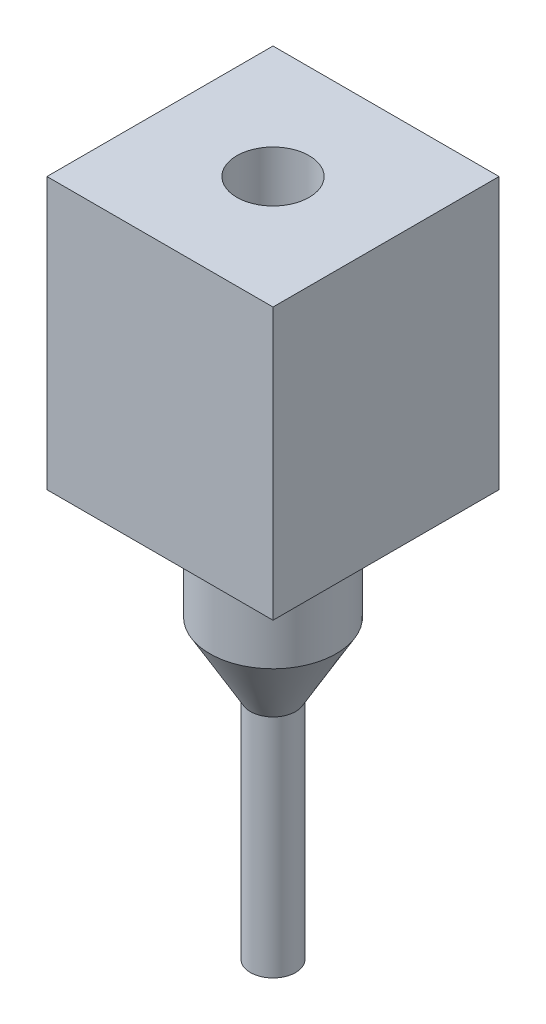
ISO-10303-21;
HEADER;
FILE_DESCRIPTION(('STEP AP214'),'2;1');
FILE_NAME('part.step','',(''),(''),'','','');
FILE_SCHEMA(('AUTOMOTIVE_DESIGN { 1 0 10303 214 1 1 1 1 }'));
ENDSEC;
DATA;
#1=APPLICATION_CONTEXT('core data for automotive mechanical design processes');
#2=APPLICATION_PROTOCOL_DEFINITION('international standard','automotive_design',2000,#1);
#3=PRODUCT_CONTEXT('',#1,'mechanical');
#4=PRODUCT('Part','Part','',(#3));
#5=PRODUCT_RELATED_PRODUCT_CATEGORY('part','',(#4));
#6=PRODUCT_DEFINITION_FORMATION('','',#4);
#7=PRODUCT_DEFINITION_CONTEXT('part definition',#1,'design');
#8=PRODUCT_DEFINITION('design','',#6,#7);
#9=PRODUCT_DEFINITION_SHAPE('','',#8);
#10=(LENGTH_UNIT() NAMED_UNIT(*) SI_UNIT(.MILLI.,.METRE.));
#11=(NAMED_UNIT(*) PLANE_ANGLE_UNIT() SI_UNIT($,.RADIAN.));
#12=(NAMED_UNIT(*) SI_UNIT($,.STERADIAN.) SOLID_ANGLE_UNIT());
#13=UNCERTAINTY_MEASURE_WITH_UNIT(LENGTH_MEASURE(1.E-05),#10,'distance_accuracy_value','');
#14=(GEOMETRIC_REPRESENTATION_CONTEXT(3) GLOBAL_UNCERTAINTY_ASSIGNED_CONTEXT((#13)) GLOBAL_UNIT_ASSIGNED_CONTEXT((#10,
#11,#12)) REPRESENTATION_CONTEXT('',''));
#15=CARTESIAN_POINT('',(0.,0.,0.));
#16=DIRECTION('',(0.,0.,1.));
#17=DIRECTION('',(1.,0.,0.));
#18=AXIS2_PLACEMENT_3D('',#15,#16,#17);
#19=CARTESIAN_POINT('',(-1.25,3.,-1.25));
#20=DIRECTION('',(1.,0.,0.));
#21=DIRECTION('',(0.,0.,-1.));
#22=AXIS2_PLACEMENT_3D('',#19,#20,#21);
#23=PLANE('',#22);
#24=DIRECTION('',(0.,0.,1.));
#25=VECTOR('',#24,1.);
#26=CARTESIAN_POINT('',(-1.25,0.,-1.25));
#27=LINE('',#26,#25);
#28=CARTESIAN_POINT('',(-1.25,0.,-1.25));
#29=VERTEX_POINT('',#28);
#30=CARTESIAN_POINT('',(-1.25,0.,1.25));
#31=VERTEX_POINT('',#30);
#32=EDGE_CURVE('E105',#29,#31,#27,.T.);
#33=ORIENTED_EDGE('',*,*,#32,.T.);
#34=DIRECTION('',(0.,-1.,0.));
#35=VECTOR('',#34,1.);
#36=CARTESIAN_POINT('',(-1.25,3.,1.25));
#37=LINE('',#36,#35);
#38=CARTESIAN_POINT('',(-1.25,3.,1.25));
#39=VERTEX_POINT('',#38);
#40=EDGE_CURVE('E96',#39,#31,#37,.T.);
#41=ORIENTED_EDGE('',*,*,#40,.F.);
#42=DIRECTION('',(0.,0.,1.));
#43=VECTOR('',#42,1.);
#44=CARTESIAN_POINT('',(-1.25,3.,-1.25));
#45=LINE('',#44,#43);
#46=CARTESIAN_POINT('',(-1.25,3.,-1.25));
#47=VERTEX_POINT('',#46);
#48=EDGE_CURVE('E90',#47,#39,#45,.T.);
#49=ORIENTED_EDGE('',*,*,#48,.F.);
#50=DIRECTION('',(0.,-1.,0.));
#51=VECTOR('',#50,1.);
#52=CARTESIAN_POINT('',(-1.25,3.,-1.25));
#53=LINE('',#52,#51);
#54=EDGE_CURVE('E101',#47,#29,#53,.T.);
#55=ORIENTED_EDGE('',*,*,#54,.T.);
#56=EDGE_LOOP('',(#33,#41,#49,#55));
#57=FACE_BOUND('',#56,.T.);
#58=ADVANCED_FACE('F37',(#57),#23,.F.);
#59=CARTESIAN_POINT('',(1.25,3.,1.25));
#60=DIRECTION('',(0.,0.,-1.));
#61=DIRECTION('',(-1.,0.,0.));
#62=AXIS2_PLACEMENT_3D('',#59,#60,#61);
#63=PLANE('',#62);
#64=DIRECTION('',(1.,0.,0.));
#65=VECTOR('',#64,1.);
#66=CARTESIAN_POINT('',(1.25,0.,1.25));
#67=LINE('',#66,#65);
#68=CARTESIAN_POINT('',(1.25,0.,1.25));
#69=VERTEX_POINT('',#68);
#70=EDGE_CURVE('E95',#31,#69,#67,.T.);
#71=ORIENTED_EDGE('',*,*,#70,.T.);
#72=DIRECTION('',(0.,-1.,0.));
#73=VECTOR('',#72,1.);
#74=CARTESIAN_POINT('',(1.25,3.,1.25));
#75=LINE('',#74,#73);
#76=CARTESIAN_POINT('',(1.25,3.,1.25));
#77=VERTEX_POINT('',#76);
#78=EDGE_CURVE('E93',#77,#69,#75,.T.);
#79=ORIENTED_EDGE('',*,*,#78,.F.);
#80=DIRECTION('',(1.,0.,0.));
#81=VECTOR('',#80,1.);
#82=CARTESIAN_POINT('',(1.25,3.,1.25));
#83=LINE('',#82,#81);
#84=EDGE_CURVE('E85',#39,#77,#83,.T.);
#85=ORIENTED_EDGE('',*,*,#84,.F.);
#86=ORIENTED_EDGE('',*,*,#40,.T.);
#87=EDGE_LOOP('',(#71,#79,#85,#86));
#88=FACE_BOUND('',#87,.T.);
#89=ADVANCED_FACE('F94',(#88),#63,.F.);
#90=CARTESIAN_POINT('',(1.25,3.,-1.25));
#91=DIRECTION('',(-1.,0.,0.));
#92=DIRECTION('',(0.,0.,1.));
#93=AXIS2_PLACEMENT_3D('',#90,#91,#92);
#94=PLANE('',#93);
#95=DIRECTION('',(0.,0.,-1.));
#96=VECTOR('',#95,1.);
#97=CARTESIAN_POINT('',(1.25,0.,-1.25));
#98=LINE('',#97,#96);
#99=CARTESIAN_POINT('',(1.25,0.,-1.25));
#100=VERTEX_POINT('',#99);
#101=EDGE_CURVE('E71',#69,#100,#98,.T.);
#102=ORIENTED_EDGE('',*,*,#101,.T.);
#103=DIRECTION('',(0.,-1.,0.));
#104=VECTOR('',#103,1.);
#105=CARTESIAN_POINT('',(1.25,3.,-1.25));
#106=LINE('',#105,#104);
#107=CARTESIAN_POINT('',(1.25,3.,-1.25));
#108=VERTEX_POINT('',#107);
#109=EDGE_CURVE('E97',#108,#100,#106,.T.);
#110=ORIENTED_EDGE('',*,*,#109,.F.);
#111=DIRECTION('',(0.,0.,-1.));
#112=VECTOR('',#111,1.);
#113=CARTESIAN_POINT('',(1.25,3.,-1.25));
#114=LINE('',#113,#112);
#115=EDGE_CURVE('E88',#77,#108,#114,.T.);
#116=ORIENTED_EDGE('',*,*,#115,.F.);
#117=ORIENTED_EDGE('',*,*,#78,.T.);
#118=EDGE_LOOP('',(#102,#110,#116,#117));
#119=FACE_BOUND('',#118,.T.);
#120=ADVANCED_FACE('F99',(#119),#94,.F.);
#121=CARTESIAN_POINT('',(1.25,3.,-1.25));
#122=DIRECTION('',(0.,0.,1.));
#123=DIRECTION('',(1.,0.,0.));
#124=AXIS2_PLACEMENT_3D('',#121,#122,#123);
#125=PLANE('',#124);
#126=DIRECTION('',(-1.,0.,0.));
#127=VECTOR('',#126,1.);
#128=CARTESIAN_POINT('',(1.25,0.,-1.25));
#129=LINE('',#128,#127);
#130=EDGE_CURVE('E77',#100,#29,#129,.T.);
#131=ORIENTED_EDGE('',*,*,#130,.T.);
#132=ORIENTED_EDGE('',*,*,#54,.F.);
#133=DIRECTION('',(-1.,0.,0.));
#134=VECTOR('',#133,1.);
#135=CARTESIAN_POINT('',(1.25,3.,-1.25));
#136=LINE('',#135,#134);
#137=EDGE_CURVE('E54',#108,#47,#136,.T.);
#138=ORIENTED_EDGE('',*,*,#137,.F.);
#139=ORIENTED_EDGE('',*,*,#109,.T.);
#140=EDGE_LOOP('',(#131,#132,#138,#139));
#141=FACE_BOUND('',#140,.T.);
#142=ADVANCED_FACE('F143',(#141),#125,.F.);
#143=CARTESIAN_POINT('',(0.,3.,0.));
#144=DIRECTION('',(0.,-1.,0.));
#145=DIRECTION('',(0.,0.,-1.));
#146=AXIS2_PLACEMENT_3D('',#143,#144,#145);
#147=PLANE('',#146);
#148=CARTESIAN_POINT('',(0.,3.,0.));
#149=DIRECTION('',(0.,1.,0.));
#150=DIRECTION('',(0.,0.,1.));
#151=AXIS2_PLACEMENT_3D('',#148,#149,#150);
#152=CIRCLE('',#151,0.4);
#153=CARTESIAN_POINT('',(0.,3.,0.4));
#154=VERTEX_POINT('',#153);
#155=EDGE_CURVE('E126',#154,#154,#152,.T.);
#156=ORIENTED_EDGE('',*,*,#155,.F.);
#157=EDGE_LOOP('',(#156));
#158=FACE_BOUND('',#157,.T.);
#159=ORIENTED_EDGE('',*,*,#48,.T.);
#160=ORIENTED_EDGE('',*,*,#84,.T.);
#161=ORIENTED_EDGE('',*,*,#115,.T.);
#162=ORIENTED_EDGE('',*,*,#137,.T.);
#163=EDGE_LOOP('',(#159,#160,#161,#162));
#164=FACE_BOUND('',#163,.T.);
#165=ADVANCED_FACE('F86',(#158,#164),#147,.F.);
#166=CARTESIAN_POINT('',(0.,0.,0.));
#167=DIRECTION('',(0.,-1.,0.));
#168=DIRECTION('',(0.,0.,-1.));
#169=AXIS2_PLACEMENT_3D('',#166,#167,#168);
#170=PLANE('',#169);
#171=CARTESIAN_POINT('',(0.,0.,0.));
#172=DIRECTION('',(0.,-1.,0.));
#173=DIRECTION('',(0.,0.,-1.));
#174=AXIS2_PLACEMENT_3D('',#171,#172,#173);
#175=CIRCLE('',#174,0.7);
#176=CARTESIAN_POINT('',(0.,0.,-0.7));
#177=VERTEX_POINT('',#176);
#178=EDGE_CURVE('E114',#177,#177,#175,.T.);
#179=ORIENTED_EDGE('',*,*,#178,.F.);
#180=EDGE_LOOP('',(#179));
#181=FACE_BOUND('',#180,.T.);
#182=ORIENTED_EDGE('',*,*,#32,.F.);
#183=ORIENTED_EDGE('',*,*,#130,.F.);
#184=ORIENTED_EDGE('',*,*,#101,.F.);
#185=ORIENTED_EDGE('',*,*,#70,.F.);
#186=EDGE_LOOP('',(#182,#183,#184,#185));
#187=FACE_BOUND('',#186,.T.);
#188=ADVANCED_FACE('F142',(#181,#187),#170,.T.);
#189=CARTESIAN_POINT('',(0.,-2.,0.));
#190=DIRECTION('',(0.,1.,0.));
#191=DIRECTION('',(0.,0.,1.));
#192=AXIS2_PLACEMENT_3D('',#189,#190,#191);
#193=CYLINDRICAL_SURFACE('',#192,0.7);
#194=CARTESIAN_POINT('',(0.,-1.220577136594,0.));
#195=DIRECTION('',(0.,-1.,0.));
#196=DIRECTION('',(0.,0.,-1.));
#197=AXIS2_PLACEMENT_3D('',#194,#195,#196);
#198=CIRCLE('',#197,0.7);
#199=CARTESIAN_POINT('',(0.,-1.220577136594,-0.7));
#200=VERTEX_POINT('',#199);
#201=EDGE_CURVE('E11',#200,#200,#198,.F.);
#202=ORIENTED_EDGE('',*,*,#201,.T.);
#203=EDGE_LOOP('',(#202));
#204=FACE_BOUND('',#203,.T.);
#205=ORIENTED_EDGE('',*,*,#178,.T.);
#206=EDGE_LOOP('',(#205));
#207=FACE_BOUND('',#206,.T.);
#208=ADVANCED_FACE('F149',(#204,#207),#193,.T.);
#209=CARTESIAN_POINT('',(0.,-2.,0.));
#210=DIRECTION('',(0.,1.,0.));
#211=DIRECTION('',(0.,0.,1.));
#212=AXIS2_PLACEMENT_3D('',#209,#210,#211);
#213=CONICAL_SURFACE('',#212,0.25,0.523598775598297);
#214=ORIENTED_EDGE('',*,*,#201,.F.);
#215=EDGE_LOOP('',(#214));
#216=FACE_BOUND('',#215,.T.);
#217=CARTESIAN_POINT('',(0.,-2.,0.));
#218=DIRECTION('',(0.,-1.,0.));
#219=DIRECTION('',(0.,0.,-1.));
#220=AXIS2_PLACEMENT_3D('',#217,#218,#219);
#221=CIRCLE('',#220,0.25);
#222=CARTESIAN_POINT('',(0.,-2.,-0.25));
#223=VERTEX_POINT('',#222);
#224=EDGE_CURVE('E46',#223,#223,#221,.T.);
#225=ORIENTED_EDGE('',*,*,#224,.F.);
#226=EDGE_LOOP('',(#225));
#227=FACE_BOUND('',#226,.T.);
#228=ADVANCED_FACE('F39',(#216,#227),#213,.T.);
#229=CARTESIAN_POINT('',(0.,-4.5,0.));
#230=DIRECTION('',(0.,1.,0.));
#231=DIRECTION('',(0.,0.,1.));
#232=AXIS2_PLACEMENT_3D('',#229,#230,#231);
#233=CYLINDRICAL_SURFACE('',#232,0.25);
#234=CARTESIAN_POINT('',(0.,-4.5,0.));
#235=DIRECTION('',(0.,-1.,0.));
#236=DIRECTION('',(0.,0.,-1.));
#237=AXIS2_PLACEMENT_3D('',#234,#235,#236);
#238=CIRCLE('',#237,0.25);
#239=CARTESIAN_POINT('',(0.,-4.5,-0.25));
#240=VERTEX_POINT('',#239);
#241=EDGE_CURVE('E108',#240,#240,#238,.T.);
#242=ORIENTED_EDGE('',*,*,#241,.F.);
#243=EDGE_LOOP('',(#242));
#244=FACE_BOUND('',#243,.T.);
#245=ORIENTED_EDGE('',*,*,#224,.T.);
#246=EDGE_LOOP('',(#245));
#247=FACE_BOUND('',#246,.T.);
#248=ADVANCED_FACE('F194',(#244,#247),#233,.T.);
#249=CARTESIAN_POINT('',(0.,-4.5,0.));
#250=DIRECTION('',(0.,-1.,0.));
#251=DIRECTION('',(0.,0.,-1.));
#252=AXIS2_PLACEMENT_3D('',#249,#250,#251);
#253=PLANE('',#252);
#254=ORIENTED_EDGE('',*,*,#241,.T.);
#255=EDGE_LOOP('',(#254));
#256=FACE_BOUND('',#255,.T.);
#257=ADVANCED_FACE('F137',(#256),#253,.T.);
#258=CARTESIAN_POINT('',(0.,0.5,0.));
#259=DIRECTION('',(0.,1.,0.));
#260=DIRECTION('',(0.,0.,1.));
#261=AXIS2_PLACEMENT_3D('',#258,#259,#260);
#262=CYLINDRICAL_SURFACE('',#261,0.4);
#263=CARTESIAN_POINT('',(0.,0.5,0.));
#264=DIRECTION('',(0.,1.,0.));
#265=DIRECTION('',(0.,0.,1.));
#266=AXIS2_PLACEMENT_3D('',#263,#264,#265);
#267=CIRCLE('',#266,0.4);
#268=CARTESIAN_POINT('',(0.,0.5,0.4));
#269=VERTEX_POINT('',#268);
#270=EDGE_CURVE('E125',#269,#269,#267,.T.);
#271=ORIENTED_EDGE('',*,*,#270,.F.);
#272=EDGE_LOOP('',(#271));
#273=FACE_BOUND('',#272,.T.);
#274=ORIENTED_EDGE('',*,*,#155,.T.);
#275=EDGE_LOOP('',(#274));
#276=FACE_BOUND('',#275,.T.);
#277=ADVANCED_FACE('F134',(#273,#276),#262,.F.);
#278=CARTESIAN_POINT('',(0.,0.5,0.));
#279=DIRECTION('',(0.,1.,0.));
#280=DIRECTION('',(0.,0.,1.));
#281=AXIS2_PLACEMENT_3D('',#278,#279,#280);
#282=PLANE('',#281);
#283=ORIENTED_EDGE('',*,*,#270,.T.);
#284=EDGE_LOOP('',(#283));
#285=FACE_BOUND('',#284,.T.);
#286=ADVANCED_FACE('F132',(#285),#282,.T.);
#287=CLOSED_SHELL('',(#58,#89,#120,#142,#165,#188,#208,#228,#248,#257,#277,#286));
#288=MANIFOLD_SOLID_BREP('B2',#287);
#289=ADVANCED_BREP_SHAPE_REPRESENTATION('',(#18,#288),#14);
#290=SHAPE_DEFINITION_REPRESENTATION(#9,#289);
ENDSEC;
END-ISO-10303-21;
